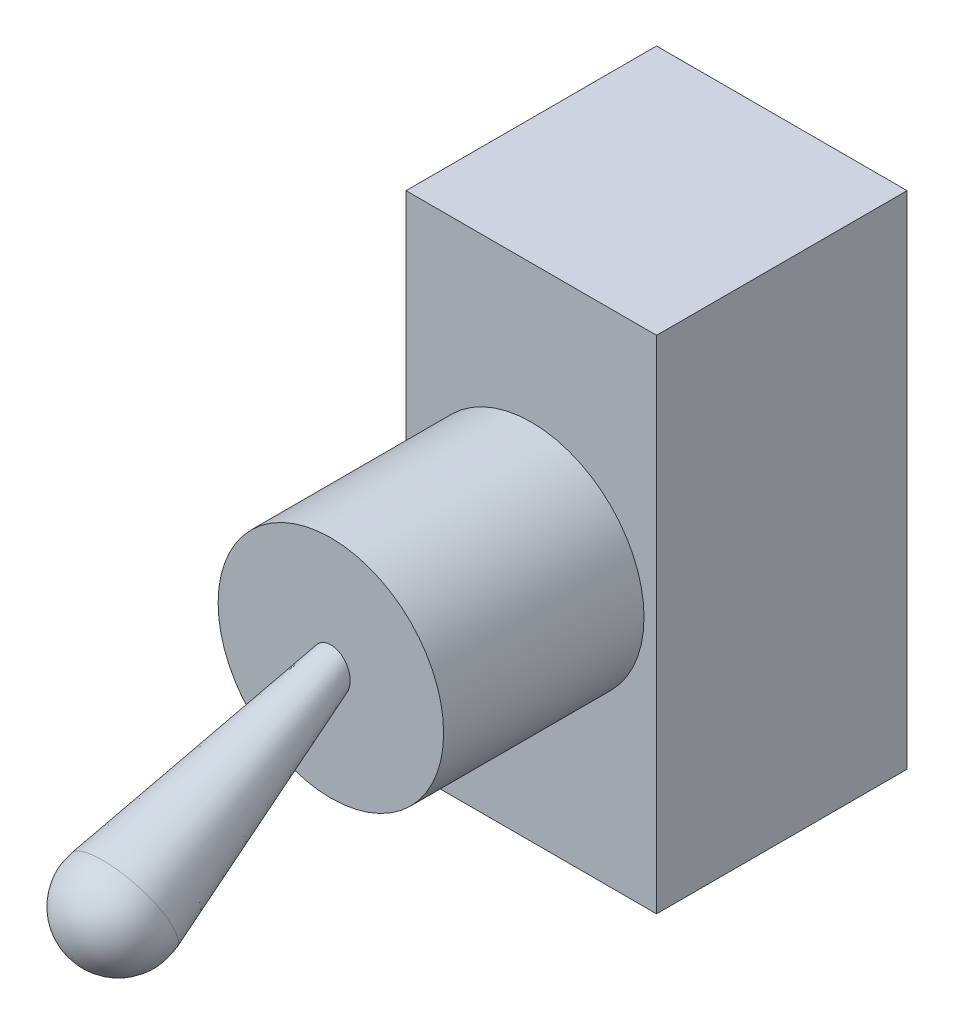
ISO-10303-21;
HEADER;
FILE_DESCRIPTION(('STEP AP214'),'2;1');
FILE_NAME('part.step','',(''),(''),'','','');
FILE_SCHEMA(('AUTOMOTIVE_DESIGN { 1 0 10303 214 1 1 1 1 }'));
ENDSEC;
DATA;
#1=APPLICATION_CONTEXT('core data for automotive mechanical design processes');
#2=APPLICATION_PROTOCOL_DEFINITION('international standard','automotive_design',2000,#1);
#3=PRODUCT_CONTEXT('',#1,'mechanical');
#4=PRODUCT('Part','Part','',(#3));
#5=PRODUCT_RELATED_PRODUCT_CATEGORY('part','',(#4));
#6=PRODUCT_DEFINITION_FORMATION('','',#4);
#7=PRODUCT_DEFINITION_CONTEXT('part definition',#1,'design');
#8=PRODUCT_DEFINITION('design','',#6,#7);
#9=PRODUCT_DEFINITION_SHAPE('','',#8);
#10=(LENGTH_UNIT() NAMED_UNIT(*) SI_UNIT(.MILLI.,.METRE.));
#11=(NAMED_UNIT(*) PLANE_ANGLE_UNIT() SI_UNIT($,.RADIAN.));
#12=(NAMED_UNIT(*) SI_UNIT($,.STERADIAN.) SOLID_ANGLE_UNIT());
#13=UNCERTAINTY_MEASURE_WITH_UNIT(LENGTH_MEASURE(1.E-05),#10,'distance_accuracy_value','');
#14=(GEOMETRIC_REPRESENTATION_CONTEXT(3) GLOBAL_UNCERTAINTY_ASSIGNED_CONTEXT((#13)) GLOBAL_UNIT_ASSIGNED_CONTEXT((#10,
#11,#12)) REPRESENTATION_CONTEXT('',''));
#15=CARTESIAN_POINT('',(0.,0.,0.));
#16=DIRECTION('',(0.,0.,1.));
#17=DIRECTION('',(1.,0.,0.));
#18=AXIS2_PLACEMENT_3D('',#15,#16,#17);
#19=CARTESIAN_POINT('',(6.35,12.7,0.));
#20=DIRECTION('',(0.,0.,-1.));
#21=DIRECTION('',(-1.,0.,0.));
#22=AXIS2_PLACEMENT_3D('',#19,#20,#21);
#23=PLANE('',#22);
#24=DIRECTION('',(1.,0.,0.));
#25=VECTOR('',#24,1.);
#26=CARTESIAN_POINT('',(-6.35,12.7,0.));
#27=LINE('',#26,#25);
#28=CARTESIAN_POINT('',(-6.35,12.7,0.));
#29=VERTEX_POINT('',#28);
#30=CARTESIAN_POINT('',(6.35,12.7,0.));
#31=VERTEX_POINT('',#30);
#32=EDGE_CURVE('E98',#29,#31,#27,.T.);
#33=ORIENTED_EDGE('',*,*,#32,.F.);
#34=DIRECTION('',(0.,-1.,0.));
#35=VECTOR('',#34,1.);
#36=CARTESIAN_POINT('',(-6.35,12.7,0.));
#37=LINE('',#36,#35);
#38=CARTESIAN_POINT('',(-6.35,-12.7,0.));
#39=VERTEX_POINT('',#38);
#40=EDGE_CURVE('E104',#29,#39,#37,.T.);
#41=ORIENTED_EDGE('',*,*,#40,.T.);
#42=DIRECTION('',(1.,0.,0.));
#43=VECTOR('',#42,1.);
#44=CARTESIAN_POINT('',(-6.35,-12.7,0.));
#45=LINE('',#44,#43);
#46=CARTESIAN_POINT('',(6.35,-12.7,0.));
#47=VERTEX_POINT('',#46);
#48=EDGE_CURVE('E102',#39,#47,#45,.T.);
#49=ORIENTED_EDGE('',*,*,#48,.T.);
#50=DIRECTION('',(0.,-1.,0.));
#51=VECTOR('',#50,1.);
#52=CARTESIAN_POINT('',(6.35,12.7,0.));
#53=LINE('',#52,#51);
#54=EDGE_CURVE('E87',#31,#47,#53,.T.);
#55=ORIENTED_EDGE('',*,*,#54,.F.);
#56=EDGE_LOOP('',(#33,#41,#49,#55));
#57=FACE_BOUND('',#56,.T.);
#58=CARTESIAN_POINT('',(0.,0.,0.));
#59=DIRECTION('',(0.,0.,-1.));
#60=DIRECTION('',(-1.,0.,0.));
#61=AXIS2_PLACEMENT_3D('',#58,#59,#60);
#62=CIRCLE('',#61,5.715);
#63=CARTESIAN_POINT('',(-5.715,0.,0.));
#64=VERTEX_POINT('',#63);
#65=EDGE_CURVE('E110',#64,#64,#62,.F.);
#66=ORIENTED_EDGE('',*,*,#65,.F.);
#67=EDGE_LOOP('',(#66));
#68=FACE_BOUND('',#67,.T.);
#69=ADVANCED_FACE('F30',(#57,#68),#23,.F.);
#70=CARTESIAN_POINT('',(-6.35,12.7,-12.7));
#71=DIRECTION('',(0.,-1.,0.));
#72=DIRECTION('',(0.,0.,-1.));
#73=AXIS2_PLACEMENT_3D('',#70,#71,#72);
#74=PLANE('',#73);
#75=ORIENTED_EDGE('',*,*,#32,.T.);
#76=DIRECTION('',(0.,0.,1.));
#77=VECTOR('',#76,1.);
#78=CARTESIAN_POINT('',(6.35,12.7,-12.7));
#79=LINE('',#78,#77);
#80=CARTESIAN_POINT('',(6.35,12.7,-12.7));
#81=VERTEX_POINT('',#80);
#82=EDGE_CURVE('E90',#81,#31,#79,.T.);
#83=ORIENTED_EDGE('',*,*,#82,.F.);
#84=DIRECTION('',(1.,0.,0.));
#85=VECTOR('',#84,1.);
#86=CARTESIAN_POINT('',(-6.35,12.7,-12.7));
#87=LINE('',#86,#85);
#88=CARTESIAN_POINT('',(-6.35,12.7,-12.7));
#89=VERTEX_POINT('',#88);
#90=EDGE_CURVE('E81',#89,#81,#87,.T.);
#91=ORIENTED_EDGE('',*,*,#90,.F.);
#92=DIRECTION('',(0.,0.,1.));
#93=VECTOR('',#92,1.);
#94=CARTESIAN_POINT('',(-6.35,12.7,-12.7));
#95=LINE('',#94,#93);
#96=EDGE_CURVE('E47',#89,#29,#95,.T.);
#97=ORIENTED_EDGE('',*,*,#96,.T.);
#98=EDGE_LOOP('',(#75,#83,#91,#97));
#99=FACE_BOUND('',#98,.T.);
#100=ADVANCED_FACE('F130',(#99),#74,.F.);
#101=CARTESIAN_POINT('',(6.35,12.7,-12.7));
#102=DIRECTION('',(-1.,0.,0.));
#103=DIRECTION('',(0.,-1.,0.));
#104=AXIS2_PLACEMENT_3D('',#101,#102,#103);
#105=PLANE('',#104);
#106=ORIENTED_EDGE('',*,*,#54,.T.);
#107=DIRECTION('',(0.,0.,1.));
#108=VECTOR('',#107,1.);
#109=CARTESIAN_POINT('',(6.35,-12.7,-12.7));
#110=LINE('',#109,#108);
#111=CARTESIAN_POINT('',(6.35,-12.7,-12.7));
#112=VERTEX_POINT('',#111);
#113=EDGE_CURVE('E85',#112,#47,#110,.T.);
#114=ORIENTED_EDGE('',*,*,#113,.F.);
#115=DIRECTION('',(0.,-1.,0.));
#116=VECTOR('',#115,1.);
#117=CARTESIAN_POINT('',(6.35,12.7,-12.7));
#118=LINE('',#117,#116);
#119=EDGE_CURVE('E73',#81,#112,#118,.T.);
#120=ORIENTED_EDGE('',*,*,#119,.F.);
#121=ORIENTED_EDGE('',*,*,#82,.T.);
#122=EDGE_LOOP('',(#106,#114,#120,#121));
#123=FACE_BOUND('',#122,.T.);
#124=ADVANCED_FACE('F86',(#123),#105,.F.);
#125=CARTESIAN_POINT('',(-6.35,-12.7,-12.7));
#126=DIRECTION('',(0.,-1.,0.));
#127=DIRECTION('',(0.,0.,-1.));
#128=AXIS2_PLACEMENT_3D('',#125,#126,#127);
#129=PLANE('',#128);
#130=ORIENTED_EDGE('',*,*,#48,.F.);
#131=DIRECTION('',(0.,0.,1.));
#132=VECTOR('',#131,1.);
#133=CARTESIAN_POINT('',(-6.35,-12.7,-12.7));
#134=LINE('',#133,#132);
#135=CARTESIAN_POINT('',(-6.35,-12.7,-12.7));
#136=VERTEX_POINT('',#135);
#137=EDGE_CURVE('E61',#136,#39,#134,.T.);
#138=ORIENTED_EDGE('',*,*,#137,.F.);
#139=DIRECTION('',(1.,0.,0.));
#140=VECTOR('',#139,1.);
#141=CARTESIAN_POINT('',(-6.35,-12.7,-12.7));
#142=LINE('',#141,#140);
#143=EDGE_CURVE('E80',#136,#112,#142,.T.);
#144=ORIENTED_EDGE('',*,*,#143,.T.);
#145=ORIENTED_EDGE('',*,*,#113,.T.);
#146=EDGE_LOOP('',(#130,#138,#144,#145));
#147=FACE_BOUND('',#146,.T.);
#148=ADVANCED_FACE('F92',(#147),#129,.T.);
#149=CARTESIAN_POINT('',(-6.35,12.7,-12.7));
#150=DIRECTION('',(-1.,0.,0.));
#151=DIRECTION('',(0.,-1.,0.));
#152=AXIS2_PLACEMENT_3D('',#149,#150,#151);
#153=PLANE('',#152);
#154=ORIENTED_EDGE('',*,*,#40,.F.);
#155=ORIENTED_EDGE('',*,*,#96,.F.);
#156=DIRECTION('',(0.,-1.,0.));
#157=VECTOR('',#156,1.);
#158=CARTESIAN_POINT('',(-6.35,12.7,-12.7));
#159=LINE('',#158,#157);
#160=EDGE_CURVE('E93',#89,#136,#159,.T.);
#161=ORIENTED_EDGE('',*,*,#160,.T.);
#162=ORIENTED_EDGE('',*,*,#137,.T.);
#163=EDGE_LOOP('',(#154,#155,#161,#162));
#164=FACE_BOUND('',#163,.T.);
#165=ADVANCED_FACE('F140',(#164),#153,.T.);
#166=CARTESIAN_POINT('',(6.35,12.7,-12.7));
#167=DIRECTION('',(0.,0.,-1.));
#168=DIRECTION('',(-1.,0.,0.));
#169=AXIS2_PLACEMENT_3D('',#166,#167,#168);
#170=PLANE('',#169);
#171=ORIENTED_EDGE('',*,*,#90,.T.);
#172=ORIENTED_EDGE('',*,*,#119,.T.);
#173=ORIENTED_EDGE('',*,*,#143,.F.);
#174=ORIENTED_EDGE('',*,*,#160,.F.);
#175=EDGE_LOOP('',(#171,#172,#173,#174));
#176=FACE_BOUND('',#175,.T.);
#177=ADVANCED_FACE('F77',(#176),#170,.T.);
#178=CARTESIAN_POINT('',(0.,0.,10.16));
#179=DIRECTION('',(0.,0.,-1.));
#180=DIRECTION('',(-1.,0.,0.));
#181=AXIS2_PLACEMENT_3D('',#178,#179,#180);
#182=CYLINDRICAL_SURFACE('',#181,5.715);
#183=CARTESIAN_POINT('',(0.,0.,10.16));
#184=DIRECTION('',(0.,0.,1.));
#185=DIRECTION('',(1.,0.,0.));
#186=AXIS2_PLACEMENT_3D('',#183,#184,#185);
#187=CIRCLE('',#186,5.715);
#188=CARTESIAN_POINT('',(5.715,0.,10.16));
#189=VERTEX_POINT('',#188);
#190=EDGE_CURVE('E100',#189,#189,#187,.T.);
#191=ORIENTED_EDGE('',*,*,#190,.F.);
#192=EDGE_LOOP('',(#191));
#193=FACE_BOUND('',#192,.T.);
#194=ORIENTED_EDGE('',*,*,#65,.T.);
#195=EDGE_LOOP('',(#194));
#196=FACE_BOUND('',#195,.T.);
#197=ADVANCED_FACE('F164',(#193,#196),#182,.T.);
#198=CARTESIAN_POINT('',(0.,-22.2299308125134,10.16));
#199=DIRECTION('',(0.,0.,1.));
#200=DIRECTION('',(1.,0.,0.));
#201=AXIS2_PLACEMENT_3D('',#198,#199,#200);
#202=PLANE('',#201);
#203=CARTESIAN_POINT('',(0.,-0.068915342174624,10.16));
#204=DIRECTION('',(0.,0.,1.));
#205=DIRECTION('',(0.,-1.,0.));
#206=AXIS2_PLACEMENT_3D('',#203,#204,#205);
#207=ELLIPSE('',#206,1.08500418055833,0.979044182259676);
#208=CARTESIAN_POINT('',(0.,-1.15391952273295,10.16));
#209=VERTEX_POINT('',#208);
#210=EDGE_CURVE('E113',#209,#209,#207,.T.);
#211=ORIENTED_EDGE('',*,*,#210,.F.);
#212=EDGE_LOOP('',(#211));
#213=FACE_BOUND('',#212,.T.);
#214=ORIENTED_EDGE('',*,*,#190,.T.);
#215=EDGE_LOOP('',(#214));
#216=FACE_BOUND('',#215,.T.);
#217=ADVANCED_FACE('F170',(#213,#216),#202,.T.);
#218=CARTESIAN_POINT('',(0.,-6.18120710016746,23.2431432260066));
#219=DIRECTION('',(0.,-0.427178994497614,0.904167078951676));
#220=DIRECTION('',(0.,-0.904167078951676,-0.427178994497614));
#221=AXIS2_PLACEMENT_3D('',#218,#219,#220);
#222=PLANE('',#221);
#223=CARTESIAN_POINT('',(0.,-6.18120710016746,23.2431432260066));
#224=DIRECTION('',(0.,-0.427178994497614,0.904167078951676));
#225=DIRECTION('',(0.,-0.904167078951676,-0.427178994497614));
#226=AXIS2_PLACEMENT_3D('',#223,#224,#225);
#227=CIRCLE('',#226,0.018043563162933);
#228=CARTESIAN_POINT('',(0.,-6.19752149596637,23.2354353948375));
#229=VERTEX_POINT('',#228);
#230=EDGE_CURVE('E11',#229,#229,#227,.T.);
#231=ORIENTED_EDGE('',*,*,#230,.T.);
#232=EDGE_LOOP('',(#231));
#233=FACE_BOUND('',#232,.T.);
#234=ADVANCED_FACE('F126',(#233),#222,.T.);
#235=CARTESIAN_POINT('',(0.,0.185417815029893,9.76754464437479));
#236=DIRECTION('',(0.,-0.427178994497614,0.904167078951676));
#237=DIRECTION('',(0.,-0.904167078951676,-0.427178994497614));
#238=AXIS2_PLACEMENT_3D('',#235,#236,#237);
#239=CONICAL_SURFACE('',#238,0.918714076956792,0.133637130134064);
#240=CARTESIAN_POINT('',(0.,-4.95160274511745,20.6405625928476));
#241=DIRECTION('',(0.,0.427178994497614,-0.904167078951676));
#242=DIRECTION('',(0.,0.904167078951676,0.427178994497614));
#243=AXIS2_PLACEMENT_3D('',#240,#241,#242);
#244=CIRCLE('',#243,2.53539651668645);
#245=CARTESIAN_POINT('',(0.,-2.65918068264081,21.7236307274985));
#246=VERTEX_POINT('',#245);
#247=EDGE_CURVE('E39',#246,#246,#244,.T.);
#248=ORIENTED_EDGE('',*,*,#247,.T.);
#249=EDGE_LOOP('',(#248));
#250=FACE_BOUND('',#249,.T.);
#251=ORIENTED_EDGE('',*,*,#210,.T.);
#252=EDGE_LOOP('',(#251));
#253=FACE_BOUND('',#252,.T.);
#254=ADVANCED_FACE('F118',(#250,#253),#239,.T.);
#255=CARTESIAN_POINT('',(0.,-5.09617245414352,20.9465588454693));
#256=DIRECTION('',(0.,-0.427178994497614,0.904167078951676));
#257=DIRECTION('',(0.,-0.904167078951676,-0.427178994497614));
#258=AXIS2_PLACEMENT_3D('',#255,#256,#257);
#259=DEGENERATE_TOROIDAL_SURFACE('',#258,0.018043563162933,2.54,.T.);
#260=ORIENTED_EDGE('',*,*,#230,.F.);
#261=EDGE_LOOP('',(#260));
#262=FACE_BOUND('',#261,.T.);
#263=ORIENTED_EDGE('',*,*,#247,.F.);
#264=EDGE_LOOP('',(#263));
#265=FACE_BOUND('',#264,.T.);
#266=ADVANCED_FACE('F32',(#262,#265),#259,.T.);
#267=CLOSED_SHELL('',(#69,#100,#124,#148,#165,#177,#197,#217,#234,#254,#266));
#268=MANIFOLD_SOLID_BREP('B2',#267);
#269=ADVANCED_BREP_SHAPE_REPRESENTATION('',(#18,#268),#14);
#270=SHAPE_DEFINITION_REPRESENTATION(#9,#269);
ENDSEC;
END-ISO-10303-21;
